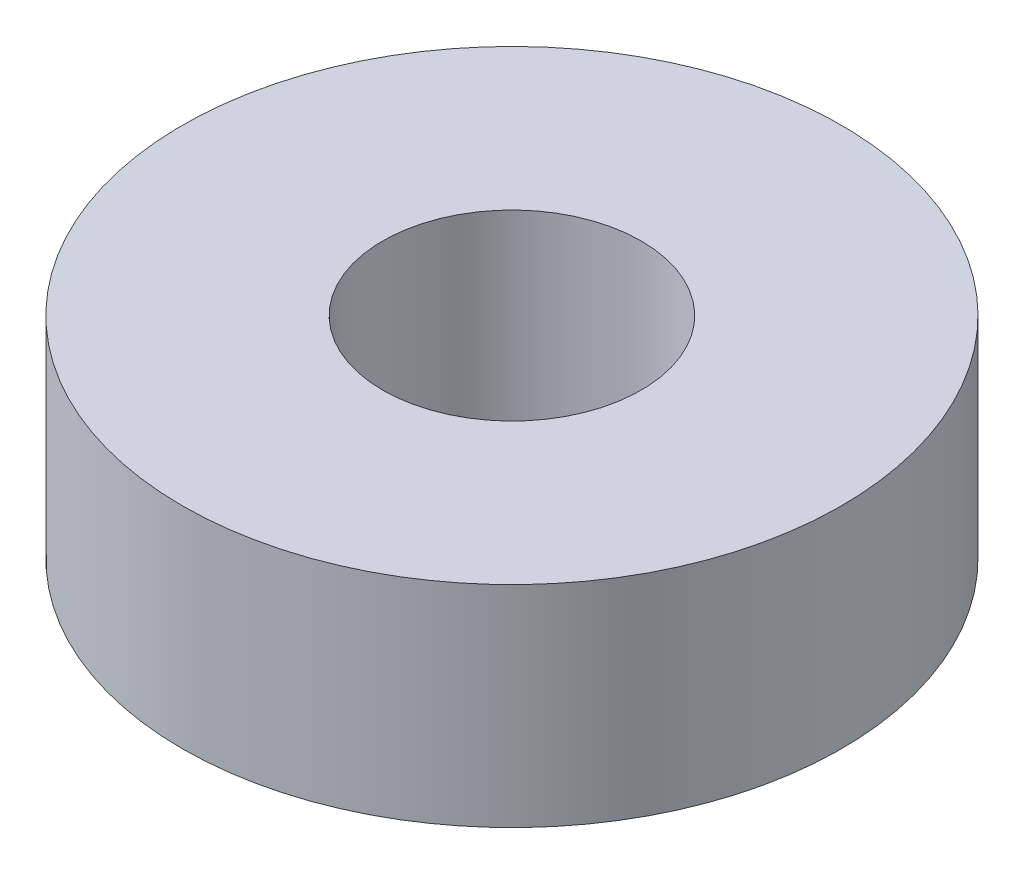
ISO-10303-21;
HEADER;
FILE_DESCRIPTION(('STEP AP214'),'2;1');
FILE_NAME('part.step','',(''),(''),'','','');
FILE_SCHEMA(('AUTOMOTIVE_DESIGN { 1 0 10303 214 1 1 1 1 }'));
ENDSEC;
DATA;
#1=APPLICATION_CONTEXT('core data for automotive mechanical design processes');
#2=APPLICATION_PROTOCOL_DEFINITION('international standard','automotive_design',2000,#1);
#3=PRODUCT_CONTEXT('',#1,'mechanical');
#4=PRODUCT('Part','Part','',(#3));
#5=PRODUCT_RELATED_PRODUCT_CATEGORY('part','',(#4));
#6=PRODUCT_DEFINITION_FORMATION('','',#4);
#7=PRODUCT_DEFINITION_CONTEXT('part definition',#1,'design');
#8=PRODUCT_DEFINITION('design','',#6,#7);
#9=PRODUCT_DEFINITION_SHAPE('','',#8);
#10=(LENGTH_UNIT() NAMED_UNIT(*) SI_UNIT(.MILLI.,.METRE.));
#11=(NAMED_UNIT(*) PLANE_ANGLE_UNIT() SI_UNIT($,.RADIAN.));
#12=(NAMED_UNIT(*) SI_UNIT($,.STERADIAN.) SOLID_ANGLE_UNIT());
#13=UNCERTAINTY_MEASURE_WITH_UNIT(LENGTH_MEASURE(1.E-05),#10,'distance_accuracy_value','');
#14=(GEOMETRIC_REPRESENTATION_CONTEXT(3) GLOBAL_UNCERTAINTY_ASSIGNED_CONTEXT((#13)) GLOBAL_UNIT_ASSIGNED_CONTEXT((#10,
#11,#12)) REPRESENTATION_CONTEXT('',''));
#15=CARTESIAN_POINT('',(0.,0.,0.));
#16=DIRECTION('',(0.,0.,1.));
#17=DIRECTION('',(1.,0.,0.));
#18=AXIS2_PLACEMENT_3D('',#15,#16,#17);
#19=CARTESIAN_POINT('',(0.,7.,0.));
#20=DIRECTION('',(0.,1.,0.));
#21=DIRECTION('',(0.,0.,1.));
#22=AXIS2_PLACEMENT_3D('',#19,#20,#21);
#23=PLANE('',#22);
#24=CARTESIAN_POINT('',(0.,7.,0.));
#25=DIRECTION('',(0.,1.,0.));
#26=DIRECTION('',(0.,0.,1.));
#27=AXIS2_PLACEMENT_3D('',#24,#25,#26);
#28=CIRCLE('',#27,10.9625);
#29=CARTESIAN_POINT('',(0.,7.,10.9625));
#30=VERTEX_POINT('',#29);
#31=EDGE_CURVE('E10',#30,#30,#28,.T.);
#32=ORIENTED_EDGE('',*,*,#31,.T.);
#33=EDGE_LOOP('',(#32));
#34=FACE_BOUND('',#33,.T.);
#35=CARTESIAN_POINT('',(0.,7.,0.));
#36=DIRECTION('',(0.,1.,0.));
#37=DIRECTION('',(0.,0.,1.));
#38=AXIS2_PLACEMENT_3D('',#35,#36,#37);
#39=CIRCLE('',#38,4.3);
#40=CARTESIAN_POINT('',(0.,7.,4.3));
#41=VERTEX_POINT('',#40);
#42=EDGE_CURVE('E42',#41,#41,#39,.T.);
#43=ORIENTED_EDGE('',*,*,#42,.F.);
#44=EDGE_LOOP('',(#43));
#45=FACE_BOUND('',#44,.T.);
#46=ADVANCED_FACE('F31',(#34,#45),#23,.T.);
#47=CARTESIAN_POINT('',(0.,0.,0.));
#48=DIRECTION('',(0.,1.,0.));
#49=DIRECTION('',(0.,0.,1.));
#50=AXIS2_PLACEMENT_3D('',#47,#48,#49);
#51=PLANE('',#50);
#52=CARTESIAN_POINT('',(0.,0.,0.));
#53=DIRECTION('',(0.,1.,0.));
#54=DIRECTION('',(0.,0.,1.));
#55=AXIS2_PLACEMENT_3D('',#52,#53,#54);
#56=CIRCLE('',#55,10.9625);
#57=CARTESIAN_POINT('',(0.,0.,10.9625));
#58=VERTEX_POINT('',#57);
#59=EDGE_CURVE('E35',#58,#58,#56,.T.);
#60=ORIENTED_EDGE('',*,*,#59,.F.);
#61=EDGE_LOOP('',(#60));
#62=FACE_BOUND('',#61,.T.);
#63=CARTESIAN_POINT('',(0.,0.,0.));
#64=DIRECTION('',(0.,1.,0.));
#65=DIRECTION('',(0.,0.,1.));
#66=AXIS2_PLACEMENT_3D('',#63,#64,#65);
#67=CIRCLE('',#66,4.3);
#68=CARTESIAN_POINT('',(0.,0.,4.3));
#69=VERTEX_POINT('',#68);
#70=EDGE_CURVE('E44',#69,#69,#67,.T.);
#71=ORIENTED_EDGE('',*,*,#70,.T.);
#72=EDGE_LOOP('',(#71));
#73=FACE_BOUND('',#72,.T.);
#74=ADVANCED_FACE('F54',(#62,#73),#51,.F.);
#75=CARTESIAN_POINT('',(0.,7.,0.));
#76=DIRECTION('',(0.,-1.,0.));
#77=DIRECTION('',(0.,0.,-1.));
#78=AXIS2_PLACEMENT_3D('',#75,#76,#77);
#79=CYLINDRICAL_SURFACE('',#78,10.9625);
#80=ORIENTED_EDGE('',*,*,#31,.F.);
#81=EDGE_LOOP('',(#80));
#82=FACE_BOUND('',#81,.T.);
#83=ORIENTED_EDGE('',*,*,#59,.T.);
#84=EDGE_LOOP('',(#83));
#85=FACE_BOUND('',#84,.T.);
#86=ADVANCED_FACE('F33',(#82,#85),#79,.T.);
#87=CARTESIAN_POINT('',(0.,7.,0.));
#88=DIRECTION('',(0.,-1.,0.));
#89=DIRECTION('',(0.,0.,-1.));
#90=AXIS2_PLACEMENT_3D('',#87,#88,#89);
#91=CYLINDRICAL_SURFACE('',#90,4.3);
#92=ORIENTED_EDGE('',*,*,#42,.T.);
#93=EDGE_LOOP('',(#92));
#94=FACE_BOUND('',#93,.T.);
#95=ORIENTED_EDGE('',*,*,#70,.F.);
#96=EDGE_LOOP('',(#95));
#97=FACE_BOUND('',#96,.T.);
#98=ADVANCED_FACE('F50',(#94,#97),#91,.F.);
#99=CLOSED_SHELL('',(#46,#74,#86,#98));
#100=MANIFOLD_SOLID_BREP('B2',#99);
#101=ADVANCED_BREP_SHAPE_REPRESENTATION('',(#18,#100),#14);
#102=SHAPE_DEFINITION_REPRESENTATION(#9,#101);
ENDSEC;
END-ISO-10303-21;
